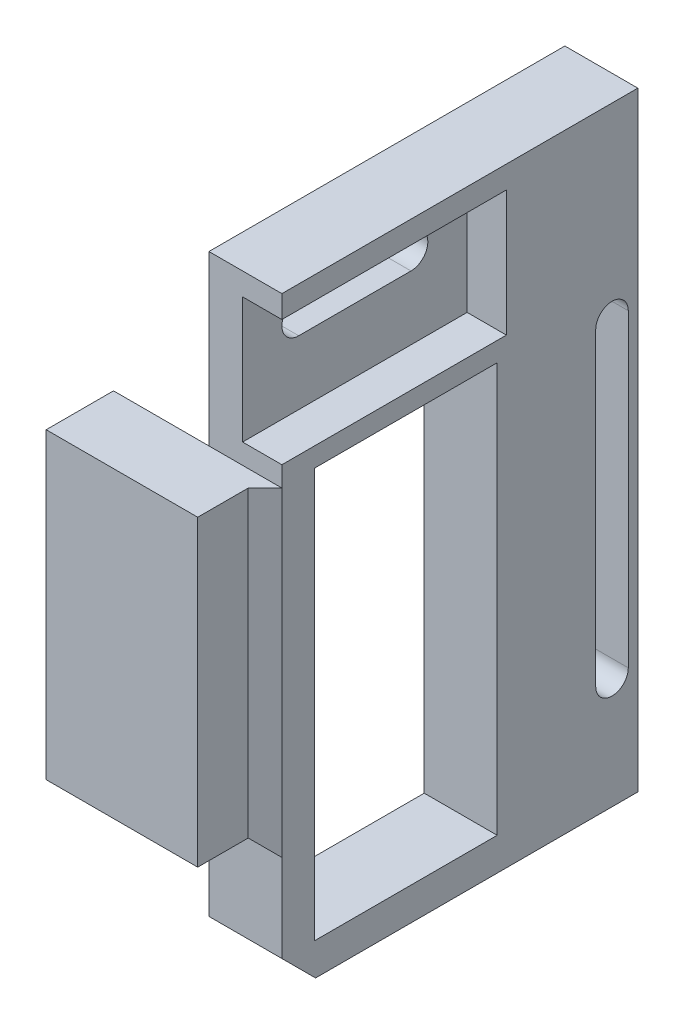
ISO-10303-21;
HEADER;
FILE_DESCRIPTION(('STEP AP214'),'2;1');
FILE_NAME('part.step','',(''),(''),'','','');
FILE_SCHEMA(('AUTOMOTIVE_DESIGN { 1 0 10303 214 1 1 1 1 }'));
ENDSEC;
DATA;
#1=APPLICATION_CONTEXT('core data for automotive mechanical design processes');
#2=APPLICATION_PROTOCOL_DEFINITION('international standard','automotive_design',2000,#1);
#3=PRODUCT_CONTEXT('',#1,'mechanical');
#4=PRODUCT('Part','Part','',(#3));
#5=PRODUCT_RELATED_PRODUCT_CATEGORY('part','',(#4));
#6=PRODUCT_DEFINITION_FORMATION('','',#4);
#7=PRODUCT_DEFINITION_CONTEXT('part definition',#1,'design');
#8=PRODUCT_DEFINITION('design','',#6,#7);
#9=PRODUCT_DEFINITION_SHAPE('','',#8);
#10=(LENGTH_UNIT() NAMED_UNIT(*) SI_UNIT(.MILLI.,.METRE.));
#11=(NAMED_UNIT(*) PLANE_ANGLE_UNIT() SI_UNIT($,.RADIAN.));
#12=(NAMED_UNIT(*) SI_UNIT($,.STERADIAN.) SOLID_ANGLE_UNIT());
#13=UNCERTAINTY_MEASURE_WITH_UNIT(LENGTH_MEASURE(1.E-05),#10,'distance_accuracy_value','');
#14=(GEOMETRIC_REPRESENTATION_CONTEXT(3) GLOBAL_UNCERTAINTY_ASSIGNED_CONTEXT((#13)) GLOBAL_UNIT_ASSIGNED_CONTEXT((#10,
#11,#12)) REPRESENTATION_CONTEXT('',''));
#15=CARTESIAN_POINT('',(0.,0.,0.));
#16=DIRECTION('',(0.,0.,1.));
#17=DIRECTION('',(1.,0.,0.));
#18=AXIS2_PLACEMENT_3D('',#15,#16,#17);
#19=CARTESIAN_POINT('',(6.5,-21.15,13.55));
#20=DIRECTION('',(0.,0.,-1.));
#21=DIRECTION('',(-1.,0.,0.));
#22=AXIS2_PLACEMENT_3D('',#19,#20,#21);
#23=PLANE('',#22);
#24=DIRECTION('',(-1.,0.,0.));
#25=VECTOR('',#24,1.);
#26=CARTESIAN_POINT('',(5.,18.15,13.55));
#27=LINE('',#26,#25);
#28=CARTESIAN_POINT('',(6.5,18.15,13.55));
#29=VERTEX_POINT('',#28);
#30=CARTESIAN_POINT('',(0.,18.15,13.55));
#31=VERTEX_POINT('',#30);
#32=EDGE_CURVE('E343',#29,#31,#27,.T.);
#33=ORIENTED_EDGE('',*,*,#32,.F.);
#34=DIRECTION('',(0.,-1.,0.));
#35=VECTOR('',#34,1.);
#36=CARTESIAN_POINT('',(6.5,-21.15,13.55));
#37=LINE('',#36,#35);
#38=CARTESIAN_POINT('',(6.5,19.95,13.55));
#39=VERTEX_POINT('',#38);
#40=EDGE_CURVE('E401',#39,#29,#37,.T.);
#41=ORIENTED_EDGE('',*,*,#40,.F.);
#42=DIRECTION('',(-1.,0.,0.));
#43=VECTOR('',#42,1.);
#44=CARTESIAN_POINT('',(6.5,19.95,13.55));
#45=LINE('',#44,#43);
#46=CARTESIAN_POINT('',(3.,19.95,13.55));
#47=VERTEX_POINT('',#46);
#48=EDGE_CURVE('E379',#39,#47,#45,.T.);
#49=ORIENTED_EDGE('',*,*,#48,.T.);
#50=DIRECTION('',(0.,1.,0.));
#51=VECTOR('',#50,1.);
#52=CARTESIAN_POINT('',(3.,31.15,13.55));
#53=LINE('',#52,#51);
#54=CARTESIAN_POINT('',(3.,31.15,13.55));
#55=VERTEX_POINT('',#54);
#56=EDGE_CURVE('E360',#47,#55,#53,.T.);
#57=ORIENTED_EDGE('',*,*,#56,.T.);
#58=DIRECTION('',(-1.,0.,0.));
#59=VECTOR('',#58,1.);
#60=CARTESIAN_POINT('',(6.5,31.15,13.55));
#61=LINE('',#60,#59);
#62=CARTESIAN_POINT('',(6.5,31.15,13.55));
#63=VERTEX_POINT('',#62);
#64=EDGE_CURVE('E378',#63,#55,#61,.T.);
#65=ORIENTED_EDGE('',*,*,#64,.F.);
#66=CARTESIAN_POINT('',(6.5,33.15,13.55));
#67=VERTEX_POINT('',#66);
#68=EDGE_CURVE('E397',#67,#63,#37,.T.);
#69=ORIENTED_EDGE('',*,*,#68,.F.);
#70=DIRECTION('',(1.,0.,0.));
#71=VECTOR('',#70,1.);
#72=CARTESIAN_POINT('',(0.,33.15,13.55));
#73=LINE('',#72,#71);
#74=CARTESIAN_POINT('',(0.,33.15,13.55));
#75=VERTEX_POINT('',#74);
#76=EDGE_CURVE('E392',#75,#67,#73,.T.);
#77=ORIENTED_EDGE('',*,*,#76,.F.);
#78=DIRECTION('',(0.,-1.,0.));
#79=VECTOR('',#78,1.);
#80=CARTESIAN_POINT('',(0.,-21.15,13.55));
#81=LINE('',#80,#79);
#82=EDGE_CURVE('E405',#75,#31,#81,.T.);
#83=ORIENTED_EDGE('',*,*,#82,.T.);
#84=EDGE_LOOP('',(#33,#41,#49,#57,#65,#69,#77,#83));
#85=FACE_BOUND('',#84,.T.);
#86=ADVANCED_FACE('F37',(#85),#23,.F.);
#87=CARTESIAN_POINT('',(6.5,0.,0.));
#88=DIRECTION('',(-1.,0.,0.));
#89=DIRECTION('',(0.,0.,1.));
#90=AXIS2_PLACEMENT_3D('',#87,#88,#89);
#91=PLANE('',#90);
#92=DIRECTION('',(0.,1.,0.));
#93=VECTOR('',#92,1.);
#94=CARTESIAN_POINT('',(6.5,11.85,-14.407848490102));
#95=LINE('',#94,#93);
#96=CARTESIAN_POINT('',(6.5,-11.15,-14.407848490102));
#97=VERTEX_POINT('',#96);
#98=CARTESIAN_POINT('',(6.5,16.4,-14.407848490102));
#99=VERTEX_POINT('',#98);
#100=EDGE_CURVE('E244',#97,#99,#95,.T.);
#101=ORIENTED_EDGE('',*,*,#100,.T.);
#102=CARTESIAN_POINT('',(6.5,16.4,-15.857848490102));
#103=DIRECTION('',(1.,0.,0.));
#104=DIRECTION('',(0.,0.,-1.));
#105=AXIS2_PLACEMENT_3D('',#102,#103,#104);
#106=CIRCLE('',#105,1.45);
#107=CARTESIAN_POINT('',(6.5,16.4,-17.307848490102));
#108=VERTEX_POINT('',#107);
#109=EDGE_CURVE('E237',#108,#99,#106,.T.);
#110=ORIENTED_EDGE('',*,*,#109,.F.);
#111=DIRECTION('',(0.,-1.,0.));
#112=VECTOR('',#111,1.);
#113=CARTESIAN_POINT('',(6.5,11.85,-17.307848490102));
#114=LINE('',#113,#112);
#115=CARTESIAN_POINT('',(6.5,-11.15,-17.307848490102));
#116=VERTEX_POINT('',#115);
#117=EDGE_CURVE('E223',#108,#116,#114,.T.);
#118=ORIENTED_EDGE('',*,*,#117,.T.);
#119=CARTESIAN_POINT('',(6.5,-11.15,-15.857848490102));
#120=DIRECTION('',(-1.,0.,0.));
#121=DIRECTION('',(0.,0.,1.));
#122=AXIS2_PLACEMENT_3D('',#119,#120,#121);
#123=CIRCLE('',#122,1.45);
#124=EDGE_CURVE('E53',#116,#97,#123,.T.);
#125=ORIENTED_EDGE('',*,*,#124,.T.);
#126=EDGE_LOOP('',(#101,#110,#118,#125));
#127=FACE_BOUND('',#126,.T.);
#128=DIRECTION('',(0.,0.,1.));
#129=VECTOR('',#128,1.);
#130=CARTESIAN_POINT('',(6.5,-18.23,-5.63));
#131=LINE('',#130,#129);
#132=CARTESIAN_POINT('',(6.5,-18.23,-5.63));
#133=VERTEX_POINT('',#132);
#134=CARTESIAN_POINT('',(6.5,-18.23,10.63));
#135=VERTEX_POINT('',#134);
#136=EDGE_CURVE('E300',#133,#135,#131,.T.);
#137=ORIENTED_EDGE('',*,*,#136,.T.);
#138=DIRECTION('',(0.,1.,0.));
#139=VECTOR('',#138,1.);
#140=CARTESIAN_POINT('',(6.5,-18.23,10.63));
#141=LINE('',#140,#139);
#142=CARTESIAN_POINT('',(6.5,18.23,10.63));
#143=VERTEX_POINT('',#142);
#144=EDGE_CURVE('E290',#135,#143,#141,.T.);
#145=ORIENTED_EDGE('',*,*,#144,.T.);
#146=DIRECTION('',(0.,0.,-1.));
#147=VECTOR('',#146,1.);
#148=CARTESIAN_POINT('',(6.5,18.23,10.63));
#149=LINE('',#148,#147);
#150=CARTESIAN_POINT('',(6.5,18.23,-5.63));
#151=VERTEX_POINT('',#150);
#152=EDGE_CURVE('E293',#143,#151,#149,.T.);
#153=ORIENTED_EDGE('',*,*,#152,.T.);
#154=DIRECTION('',(0.,-1.,0.));
#155=VECTOR('',#154,1.);
#156=CARTESIAN_POINT('',(6.5,18.23,-5.63));
#157=LINE('',#156,#155);
#158=EDGE_CURVE('E297',#151,#133,#157,.T.);
#159=ORIENTED_EDGE('',*,*,#158,.T.);
#160=EDGE_LOOP('',(#137,#145,#153,#159));
#161=FACE_BOUND('',#160,.T.);
#162=DIRECTION('',(0.,0.,-1.));
#163=VECTOR('',#162,1.);
#164=CARTESIAN_POINT('',(6.5,-21.15,13.55));
#165=LINE('',#164,#163);
#166=CARTESIAN_POINT('',(6.5,-21.15,10.55));
#167=VERTEX_POINT('',#166);
#168=CARTESIAN_POINT('',(6.5,-21.15,-18.157848490102));
#169=VERTEX_POINT('',#168);
#170=EDGE_CURVE('E400',#167,#169,#165,.T.);
#171=ORIENTED_EDGE('',*,*,#170,.T.);
#172=DIRECTION('',(0.,1.,0.));
#173=VECTOR('',#172,1.);
#174=CARTESIAN_POINT('',(6.5,0.,-18.157848490102));
#175=LINE('',#174,#173);
#176=CARTESIAN_POINT('',(6.5,33.15,-18.157848490102));
#177=VERTEX_POINT('',#176);
#178=EDGE_CURVE('E357',#169,#177,#175,.T.);
#179=ORIENTED_EDGE('',*,*,#178,.T.);
#180=DIRECTION('',(0.,0.,1.));
#181=VECTOR('',#180,1.);
#182=CARTESIAN_POINT('',(6.5,33.15,-13.55));
#183=LINE('',#182,#181);
#184=EDGE_CURVE('E382',#177,#67,#183,.T.);
#185=ORIENTED_EDGE('',*,*,#184,.T.);
#186=ORIENTED_EDGE('',*,*,#68,.T.);
#187=DIRECTION('',(0.,0.,-1.));
#188=VECTOR('',#187,1.);
#189=CARTESIAN_POINT('',(6.5,31.15,13.55));
#190=LINE('',#189,#188);
#191=CARTESIAN_POINT('',(6.5,31.15,-6.45));
#192=VERTEX_POINT('',#191);
#193=EDGE_CURVE('E369',#63,#192,#190,.T.);
#194=ORIENTED_EDGE('',*,*,#193,.T.);
#195=DIRECTION('',(0.,-1.,0.));
#196=VECTOR('',#195,1.);
#197=CARTESIAN_POINT('',(6.5,31.15,-6.45));
#198=LINE('',#197,#196);
#199=CARTESIAN_POINT('',(6.5,19.95,-6.45));
#200=VERTEX_POINT('',#199);
#201=EDGE_CURVE('E372',#192,#200,#198,.T.);
#202=ORIENTED_EDGE('',*,*,#201,.T.);
#203=DIRECTION('',(0.,0.,1.));
#204=VECTOR('',#203,1.);
#205=CARTESIAN_POINT('',(6.5,19.95,13.55));
#206=LINE('',#205,#204);
#207=EDGE_CURVE('E375',#200,#39,#206,.T.);
#208=ORIENTED_EDGE('',*,*,#207,.T.);
#209=ORIENTED_EDGE('',*,*,#40,.T.);
#210=CARTESIAN_POINT('',(6.5,-10.35,13.55));
#211=VERTEX_POINT('',#210);
#212=EDGE_CURVE('E441',#29,#211,#37,.T.);
#213=ORIENTED_EDGE('',*,*,#212,.T.);
#214=CARTESIAN_POINT('',(6.5,-18.15,13.55));
#215=VERTEX_POINT('',#214);
#216=EDGE_CURVE('E402',#211,#215,#37,.T.);
#217=ORIENTED_EDGE('',*,*,#216,.T.);
#218=DIRECTION('',(0.,0.707106781186549,0.707106781186546));
#219=VECTOR('',#218,1.);
#220=CARTESIAN_POINT('',(6.5,-21.15,10.55));
#221=LINE('',#220,#219);
#222=EDGE_CURVE('E419',#215,#167,#221,.F.);
#223=ORIENTED_EDGE('',*,*,#222,.T.);
#224=EDGE_LOOP('',(#171,#179,#185,#186,#194,#202,#208,#209,#213,#217,#223));
#225=FACE_BOUND('',#224,.T.);
#226=ADVANCED_FACE('F241',(#127,#161,#225),#91,.F.);
#227=CARTESIAN_POINT('',(0.,0.,0.));
#228=DIRECTION('',(-1.,0.,0.));
#229=DIRECTION('',(0.,0.,1.));
#230=AXIS2_PLACEMENT_3D('',#227,#228,#229);
#231=PLANE('',#230);
#232=CARTESIAN_POINT('',(0.,16.4,-15.857848490102));
#233=DIRECTION('',(-1.,0.,0.));
#234=DIRECTION('',(0.,0.,1.));
#235=AXIS2_PLACEMENT_3D('',#232,#233,#234);
#236=CIRCLE('',#235,1.45);
#237=CARTESIAN_POINT('',(0.,16.4,-14.407848490102));
#238=VERTEX_POINT('',#237);
#239=CARTESIAN_POINT('',(0.,16.4,-17.307848490102));
#240=VERTEX_POINT('',#239);
#241=EDGE_CURVE('E11',#238,#240,#236,.T.);
#242=ORIENTED_EDGE('',*,*,#241,.F.);
#243=DIRECTION('',(0.,1.,0.));
#244=VECTOR('',#243,1.);
#245=CARTESIAN_POINT('',(0.,11.85,-14.407848490102));
#246=LINE('',#245,#244);
#247=CARTESIAN_POINT('',(0.,-11.15,-14.407848490102));
#248=VERTEX_POINT('',#247);
#249=EDGE_CURVE('E231',#248,#238,#246,.T.);
#250=ORIENTED_EDGE('',*,*,#249,.F.);
#251=CARTESIAN_POINT('',(0.,-11.15,-15.857848490102));
#252=DIRECTION('',(-1.,0.,0.));
#253=DIRECTION('',(0.,0.,1.));
#254=AXIS2_PLACEMENT_3D('',#251,#252,#253);
#255=CIRCLE('',#254,1.45);
#256=CARTESIAN_POINT('',(0.,-11.15,-17.307848490102));
#257=VERTEX_POINT('',#256);
#258=EDGE_CURVE('E253',#257,#248,#255,.T.);
#259=ORIENTED_EDGE('',*,*,#258,.F.);
#260=DIRECTION('',(0.,-1.,0.));
#261=VECTOR('',#260,1.);
#262=CARTESIAN_POINT('',(0.,11.85,-17.307848490102));
#263=LINE('',#262,#261);
#264=EDGE_CURVE('E248',#240,#257,#263,.T.);
#265=ORIENTED_EDGE('',*,*,#264,.F.);
#266=EDGE_LOOP('',(#242,#250,#259,#265));
#267=FACE_BOUND('',#266,.T.);
#268=DIRECTION('',(0.,-1.,0.));
#269=VECTOR('',#268,1.);
#270=CARTESIAN_POINT('',(0.,33.15,-18.157848490102));
#271=LINE('',#270,#269);
#272=CARTESIAN_POINT('',(0.,33.15,-18.157848490102));
#273=VERTEX_POINT('',#272);
#274=CARTESIAN_POINT('',(0.,-21.15,-18.157848490102));
#275=VERTEX_POINT('',#274);
#276=EDGE_CURVE('E346',#273,#275,#271,.T.);
#277=ORIENTED_EDGE('',*,*,#276,.T.);
#278=DIRECTION('',(0.,0.,-1.));
#279=VECTOR('',#278,1.);
#280=CARTESIAN_POINT('',(0.,-21.15,13.55));
#281=LINE('',#280,#279);
#282=CARTESIAN_POINT('',(0.,-21.15,10.55));
#283=VERTEX_POINT('',#282);
#284=EDGE_CURVE('E408',#283,#275,#281,.T.);
#285=ORIENTED_EDGE('',*,*,#284,.F.);
#286=DIRECTION('',(0.,-0.707106781186549,-0.707106781186546));
#287=VECTOR('',#286,1.);
#288=CARTESIAN_POINT('',(0.,-15.85,15.85));
#289=LINE('',#288,#287);
#290=CARTESIAN_POINT('',(0.,-18.15,13.55));
#291=VERTEX_POINT('',#290);
#292=EDGE_CURVE('E413',#283,#291,#289,.F.);
#293=ORIENTED_EDGE('',*,*,#292,.T.);
#294=CARTESIAN_POINT('',(0.,-10.35,13.55));
#295=VERTEX_POINT('',#294);
#296=EDGE_CURVE('E396',#295,#291,#81,.T.);
#297=ORIENTED_EDGE('',*,*,#296,.F.);
#298=DIRECTION('',(0.,0.707106781186552,0.707106781186543));
#299=VECTOR('',#298,1.);
#300=CARTESIAN_POINT('',(0.,-10.35,13.55));
#301=LINE('',#300,#299);
#302=CARTESIAN_POINT('',(0.,-8.85,15.05));
#303=VERTEX_POINT('',#302);
#304=EDGE_CURVE('E46',#295,#303,#301,.T.);
#305=ORIENTED_EDGE('',*,*,#304,.T.);
#306=DIRECTION('',(0.,0.,1.));
#307=VECTOR('',#306,1.);
#308=CARTESIAN_POINT('',(0.,-8.85,0.));
#309=LINE('',#308,#307);
#310=CARTESIAN_POINT('',(0.,-8.85,13.55));
#311=VERTEX_POINT('',#310);
#312=EDGE_CURVE('E427',#311,#303,#309,.T.);
#313=ORIENTED_EDGE('',*,*,#312,.F.);
#314=EDGE_CURVE('E409',#31,#311,#81,.T.);
#315=ORIENTED_EDGE('',*,*,#314,.F.);
#316=ORIENTED_EDGE('',*,*,#82,.F.);
#317=DIRECTION('',(0.,0.,1.));
#318=VECTOR('',#317,1.);
#319=CARTESIAN_POINT('',(0.,33.15,-13.55));
#320=LINE('',#319,#318);
#321=EDGE_CURVE('E390',#273,#75,#320,.T.);
#322=ORIENTED_EDGE('',*,*,#321,.F.);
#323=EDGE_LOOP('',(#277,#285,#293,#297,#305,#313,#315,#316,#322));
#324=FACE_BOUND('',#323,.T.);
#325=CARTESIAN_POINT('',(0.,27.15,8.55));
#326=DIRECTION('',(-1.,0.,0.));
#327=DIRECTION('',(0.,0.,1.));
#328=AXIS2_PLACEMENT_3D('',#325,#326,#327);
#329=CIRCLE('',#328,1.5);
#330=CARTESIAN_POINT('',(0.,25.65,8.55));
#331=VERTEX_POINT('',#330);
#332=CARTESIAN_POINT('',(0.,28.65,8.55));
#333=VERTEX_POINT('',#332);
#334=EDGE_CURVE('E284',#331,#333,#329,.T.);
#335=ORIENTED_EDGE('',*,*,#334,.F.);
#336=DIRECTION('',(0.,0.,1.));
#337=VECTOR('',#336,1.);
#338=CARTESIAN_POINT('',(0.,25.65,0.));
#339=LINE('',#338,#337);
#340=CARTESIAN_POINT('',(0.,25.65,-1.45));
#341=VERTEX_POINT('',#340);
#342=EDGE_CURVE('E273',#341,#331,#339,.T.);
#343=ORIENTED_EDGE('',*,*,#342,.F.);
#344=CARTESIAN_POINT('',(0.,27.15,-1.45));
#345=DIRECTION('',(-1.,0.,0.));
#346=DIRECTION('',(0.,0.,1.));
#347=AXIS2_PLACEMENT_3D('',#344,#345,#346);
#348=CIRCLE('',#347,1.5);
#349=CARTESIAN_POINT('',(0.,28.65,-1.45));
#350=VERTEX_POINT('',#349);
#351=EDGE_CURVE('E280',#350,#341,#348,.T.);
#352=ORIENTED_EDGE('',*,*,#351,.F.);
#353=DIRECTION('',(0.,0.,-1.));
#354=VECTOR('',#353,1.);
#355=CARTESIAN_POINT('',(0.,28.65,0.));
#356=LINE('',#355,#354);
#357=EDGE_CURVE('E282',#333,#350,#356,.T.);
#358=ORIENTED_EDGE('',*,*,#357,.F.);
#359=EDGE_LOOP('',(#335,#343,#352,#358));
#360=FACE_BOUND('',#359,.T.);
#361=DIRECTION('',(0.,1.,0.));
#362=VECTOR('',#361,1.);
#363=CARTESIAN_POINT('',(0.,-18.23,10.63));
#364=LINE('',#363,#362);
#365=CARTESIAN_POINT('',(0.,-18.23,10.63));
#366=VERTEX_POINT('',#365);
#367=CARTESIAN_POINT('',(0.,18.23,10.63));
#368=VERTEX_POINT('',#367);
#369=EDGE_CURVE('E289',#366,#368,#364,.T.);
#370=ORIENTED_EDGE('',*,*,#369,.F.);
#371=DIRECTION('',(0.,0.,1.));
#372=VECTOR('',#371,1.);
#373=CARTESIAN_POINT('',(0.,-18.23,-5.63));
#374=LINE('',#373,#372);
#375=CARTESIAN_POINT('',(0.,-18.23,-5.63));
#376=VERTEX_POINT('',#375);
#377=EDGE_CURVE('E294',#376,#366,#374,.T.);
#378=ORIENTED_EDGE('',*,*,#377,.F.);
#379=DIRECTION('',(0.,-1.,0.));
#380=VECTOR('',#379,1.);
#381=CARTESIAN_POINT('',(0.,18.23,-5.63));
#382=LINE('',#381,#380);
#383=CARTESIAN_POINT('',(0.,18.23,-5.63));
#384=VERTEX_POINT('',#383);
#385=EDGE_CURVE('E308',#384,#376,#382,.T.);
#386=ORIENTED_EDGE('',*,*,#385,.F.);
#387=DIRECTION('',(0.,0.,-1.));
#388=VECTOR('',#387,1.);
#389=CARTESIAN_POINT('',(0.,18.23,10.63));
#390=LINE('',#389,#388);
#391=EDGE_CURVE('E305',#368,#384,#390,.T.);
#392=ORIENTED_EDGE('',*,*,#391,.F.);
#393=EDGE_LOOP('',(#370,#378,#386,#392));
#394=FACE_BOUND('',#393,.T.);
#395=ADVANCED_FACE('F477',(#267,#324,#360,#394),#231,.T.);
#396=ORIENTED_EDGE('',*,*,#216,.F.);
#397=DIRECTION('',(-1.,0.,0.));
#398=VECTOR('',#397,1.);
#399=CARTESIAN_POINT('',(6.5,-10.35,13.55));
#400=LINE('',#399,#398);
#401=EDGE_CURVE('E421',#211,#295,#400,.T.);
#402=ORIENTED_EDGE('',*,*,#401,.T.);
#403=ORIENTED_EDGE('',*,*,#296,.T.);
#404=DIRECTION('',(1.,0.,0.));
#405=VECTOR('',#404,1.);
#406=CARTESIAN_POINT('',(6.5,-18.15,13.55));
#407=LINE('',#406,#405);
#408=EDGE_CURVE('E416',#291,#215,#407,.T.);
#409=ORIENTED_EDGE('',*,*,#408,.T.);
#410=EDGE_LOOP('',(#396,#402,#403,#409));
#411=FACE_BOUND('',#410,.T.);
#412=ADVANCED_FACE('F448',(#411),#23,.F.);
#413=CARTESIAN_POINT('',(6.5,-21.15,13.55));
#414=DIRECTION('',(0.,1.,0.));
#415=DIRECTION('',(0.,0.,1.));
#416=AXIS2_PLACEMENT_3D('',#413,#414,#415);
#417=PLANE('',#416);
#418=ORIENTED_EDGE('',*,*,#170,.F.);
#419=DIRECTION('',(-1.,0.,0.));
#420=VECTOR('',#419,1.);
#421=CARTESIAN_POINT('',(6.5,-21.15,10.55));
#422=LINE('',#421,#420);
#423=EDGE_CURVE('E404',#167,#283,#422,.T.);
#424=ORIENTED_EDGE('',*,*,#423,.T.);
#425=ORIENTED_EDGE('',*,*,#284,.T.);
#426=DIRECTION('',(1.,0.,0.));
#427=VECTOR('',#426,1.);
#428=CARTESIAN_POINT('',(0.5,-21.15,-18.157848490102));
#429=LINE('',#428,#427);
#430=EDGE_CURVE('E286',#275,#169,#429,.T.);
#431=ORIENTED_EDGE('',*,*,#430,.T.);
#432=EDGE_LOOP('',(#418,#424,#425,#431));
#433=FACE_BOUND('',#432,.T.);
#434=ADVANCED_FACE('F488',(#433),#417,.F.);
#435=CARTESIAN_POINT('',(6.5,-21.15,10.55));
#436=DIRECTION('',(0.,0.707106781186546,-0.707106781186549));
#437=DIRECTION('',(-1.,0.,0.));
#438=AXIS2_PLACEMENT_3D('',#435,#436,#437);
#439=PLANE('',#438);
#440=ORIENTED_EDGE('',*,*,#222,.F.);
#441=ORIENTED_EDGE('',*,*,#408,.F.);
#442=ORIENTED_EDGE('',*,*,#292,.F.);
#443=ORIENTED_EDGE('',*,*,#423,.F.);
#444=EDGE_LOOP('',(#440,#441,#442,#443));
#445=FACE_BOUND('',#444,.T.);
#446=ADVANCED_FACE('F485',(#445),#439,.F.);
#447=CARTESIAN_POINT('',(0.,33.15,-13.55));
#448=DIRECTION('',(0.,1.,0.));
#449=DIRECTION('',(0.,0.,1.));
#450=AXIS2_PLACEMENT_3D('',#447,#448,#449);
#451=PLANE('',#450);
#452=DIRECTION('',(1.,0.,0.));
#453=VECTOR('',#452,1.);
#454=CARTESIAN_POINT('',(0.,33.15,-18.157848490102));
#455=LINE('',#454,#453);
#456=EDGE_CURVE('E355',#273,#177,#455,.T.);
#457=ORIENTED_EDGE('',*,*,#456,.F.);
#458=ORIENTED_EDGE('',*,*,#321,.T.);
#459=ORIENTED_EDGE('',*,*,#76,.T.);
#460=ORIENTED_EDGE('',*,*,#184,.F.);
#461=EDGE_LOOP('',(#457,#458,#459,#460));
#462=FACE_BOUND('',#461,.T.);
#463=ADVANCED_FACE('F472',(#462),#451,.T.);
#464=CARTESIAN_POINT('',(6.5,19.95,13.55));
#465=DIRECTION('',(0.,-1.,0.));
#466=DIRECTION('',(0.,0.,-1.));
#467=AXIS2_PLACEMENT_3D('',#464,#465,#466);
#468=PLANE('',#467);
#469=DIRECTION('',(-1.,0.,0.));
#470=VECTOR('',#469,1.);
#471=CARTESIAN_POINT('',(6.5,19.95,-6.45));
#472=LINE('',#471,#470);
#473=CARTESIAN_POINT('',(3.,19.95,-6.45));
#474=VERTEX_POINT('',#473);
#475=EDGE_CURVE('E383',#200,#474,#472,.T.);
#476=ORIENTED_EDGE('',*,*,#475,.T.);
#477=DIRECTION('',(0.,0.,1.));
#478=VECTOR('',#477,1.);
#479=CARTESIAN_POINT('',(3.,19.95,13.55));
#480=LINE('',#479,#478);
#481=EDGE_CURVE('E367',#474,#47,#480,.T.);
#482=ORIENTED_EDGE('',*,*,#481,.T.);
#483=ORIENTED_EDGE('',*,*,#48,.F.);
#484=ORIENTED_EDGE('',*,*,#207,.F.);
#485=EDGE_LOOP('',(#476,#482,#483,#484));
#486=FACE_BOUND('',#485,.T.);
#487=ADVANCED_FACE('F458',(#486),#468,.F.);
#488=CARTESIAN_POINT('',(6.5,31.15,-6.45));
#489=DIRECTION('',(0.,0.,-1.));
#490=DIRECTION('',(0.,1.,0.));
#491=AXIS2_PLACEMENT_3D('',#488,#489,#490);
#492=PLANE('',#491);
#493=DIRECTION('',(-1.,0.,0.));
#494=VECTOR('',#493,1.);
#495=CARTESIAN_POINT('',(6.5,31.15,-6.45));
#496=LINE('',#495,#494);
#497=CARTESIAN_POINT('',(3.,31.15,-6.45));
#498=VERTEX_POINT('',#497);
#499=EDGE_CURVE('E386',#192,#498,#496,.T.);
#500=ORIENTED_EDGE('',*,*,#499,.T.);
#501=DIRECTION('',(0.,-1.,0.));
#502=VECTOR('',#501,1.);
#503=CARTESIAN_POINT('',(3.,31.15,-6.45));
#504=LINE('',#503,#502);
#505=EDGE_CURVE('E365',#498,#474,#504,.T.);
#506=ORIENTED_EDGE('',*,*,#505,.T.);
#507=ORIENTED_EDGE('',*,*,#475,.F.);
#508=ORIENTED_EDGE('',*,*,#201,.F.);
#509=EDGE_LOOP('',(#500,#506,#507,#508));
#510=FACE_BOUND('',#509,.T.);
#511=ADVANCED_FACE('F529',(#510),#492,.F.);
#512=CARTESIAN_POINT('',(6.5,31.15,13.55));
#513=DIRECTION('',(0.,1.,0.));
#514=DIRECTION('',(0.,0.,1.));
#515=AXIS2_PLACEMENT_3D('',#512,#513,#514);
#516=PLANE('',#515);
#517=ORIENTED_EDGE('',*,*,#64,.T.);
#518=DIRECTION('',(0.,0.,-1.));
#519=VECTOR('',#518,1.);
#520=CARTESIAN_POINT('',(3.,31.15,13.55));
#521=LINE('',#520,#519);
#522=EDGE_CURVE('E363',#55,#498,#521,.T.);
#523=ORIENTED_EDGE('',*,*,#522,.T.);
#524=ORIENTED_EDGE('',*,*,#499,.F.);
#525=ORIENTED_EDGE('',*,*,#193,.F.);
#526=EDGE_LOOP('',(#517,#523,#524,#525));
#527=FACE_BOUND('',#526,.T.);
#528=ADVANCED_FACE('F503',(#527),#516,.F.);
#529=CARTESIAN_POINT('',(3.,0.,0.));
#530=DIRECTION('',(1.,0.,0.));
#531=DIRECTION('',(0.,0.,-1.));
#532=AXIS2_PLACEMENT_3D('',#529,#530,#531);
#533=PLANE('',#532);
#534=CARTESIAN_POINT('',(3.,27.15,8.55));
#535=DIRECTION('',(1.,0.,0.));
#536=DIRECTION('',(0.,0.,-1.));
#537=AXIS2_PLACEMENT_3D('',#534,#535,#536);
#538=CIRCLE('',#537,1.5);
#539=CARTESIAN_POINT('',(3.,28.65,8.55));
#540=VERTEX_POINT('',#539);
#541=CARTESIAN_POINT('',(3.,25.65,8.55));
#542=VERTEX_POINT('',#541);
#543=EDGE_CURVE('E259',#540,#542,#538,.T.);
#544=ORIENTED_EDGE('',*,*,#543,.F.);
#545=DIRECTION('',(0.,0.,1.));
#546=VECTOR('',#545,1.);
#547=CARTESIAN_POINT('',(3.,28.65,8.55));
#548=LINE('',#547,#546);
#549=CARTESIAN_POINT('',(3.,28.65,-1.45));
#550=VERTEX_POINT('',#549);
#551=EDGE_CURVE('E267',#550,#540,#548,.T.);
#552=ORIENTED_EDGE('',*,*,#551,.F.);
#553=CARTESIAN_POINT('',(3.,27.15,-1.45));
#554=DIRECTION('',(1.,0.,0.));
#555=DIRECTION('',(0.,0.,-1.));
#556=AXIS2_PLACEMENT_3D('',#553,#554,#555);
#557=CIRCLE('',#556,1.5);
#558=CARTESIAN_POINT('',(3.,25.65,-1.45));
#559=VERTEX_POINT('',#558);
#560=EDGE_CURVE('E264',#559,#550,#557,.T.);
#561=ORIENTED_EDGE('',*,*,#560,.F.);
#562=DIRECTION('',(0.,0.,-1.));
#563=VECTOR('',#562,1.);
#564=CARTESIAN_POINT('',(3.,25.65,8.55));
#565=LINE('',#564,#563);
#566=EDGE_CURVE('E262',#542,#559,#565,.T.);
#567=ORIENTED_EDGE('',*,*,#566,.F.);
#568=EDGE_LOOP('',(#544,#552,#561,#567));
#569=FACE_BOUND('',#568,.T.);
#570=ORIENTED_EDGE('',*,*,#56,.F.);
#571=ORIENTED_EDGE('',*,*,#481,.F.);
#572=ORIENTED_EDGE('',*,*,#505,.F.);
#573=ORIENTED_EDGE('',*,*,#522,.F.);
#574=EDGE_LOOP('',(#570,#571,#572,#573));
#575=FACE_BOUND('',#574,.T.);
#576=ADVANCED_FACE('F462',(#569,#575),#533,.T.);
#577=CARTESIAN_POINT('',(0.,33.15,-18.157848490102));
#578=DIRECTION('',(0.,0.,1.));
#579=DIRECTION('',(1.,0.,0.));
#580=AXIS2_PLACEMENT_3D('',#577,#578,#579);
#581=PLANE('',#580);
#582=ORIENTED_EDGE('',*,*,#430,.F.);
#583=ORIENTED_EDGE('',*,*,#276,.F.);
#584=ORIENTED_EDGE('',*,*,#456,.T.);
#585=ORIENTED_EDGE('',*,*,#178,.F.);
#586=EDGE_LOOP('',(#582,#583,#584,#585));
#587=FACE_BOUND('',#586,.T.);
#588=ADVANCED_FACE('F491',(#587),#581,.F.);
#589=CARTESIAN_POINT('',(5.,18.15,13.55));
#590=DIRECTION('',(0.,0.,-1.));
#591=DIRECTION('',(0.,1.,0.));
#592=AXIS2_PLACEMENT_3D('',#589,#590,#591);
#593=PLANE('',#592);
#594=CARTESIAN_POINT('',(-8.5,18.15,13.55));
#595=VERTEX_POINT('',#594);
#596=EDGE_CURVE('E347',#31,#595,#27,.T.);
#597=ORIENTED_EDGE('',*,*,#596,.F.);
#598=ORIENTED_EDGE('',*,*,#314,.T.);
#599=DIRECTION('',(-1.,0.,0.));
#600=VECTOR('',#599,1.);
#601=CARTESIAN_POINT('',(5.,-8.85,13.55));
#602=LINE('',#601,#600);
#603=CARTESIAN_POINT('',(-8.5,-8.85,13.55));
#604=VERTEX_POINT('',#603);
#605=EDGE_CURVE('E342',#311,#604,#602,.T.);
#606=ORIENTED_EDGE('',*,*,#605,.T.);
#607=DIRECTION('',(0.,-1.,0.));
#608=VECTOR('',#607,1.);
#609=CARTESIAN_POINT('',(-8.5,18.15,13.55));
#610=LINE('',#609,#608);
#611=EDGE_CURVE('E322',#595,#604,#610,.T.);
#612=ORIENTED_EDGE('',*,*,#611,.F.);
#613=EDGE_LOOP('',(#597,#598,#606,#612));
#614=FACE_BOUND('',#613,.T.);
#615=ADVANCED_FACE('F493',(#614),#593,.T.);
#616=CARTESIAN_POINT('',(5.,18.15,13.55));
#617=DIRECTION('',(0.,1.,0.));
#618=DIRECTION('',(0.,0.,1.));
#619=AXIS2_PLACEMENT_3D('',#616,#617,#618);
#620=PLANE('',#619);
#621=ORIENTED_EDGE('',*,*,#32,.T.);
#622=ORIENTED_EDGE('',*,*,#596,.T.);
#623=DIRECTION('',(0.,0.,-1.));
#624=VECTOR('',#623,1.);
#625=CARTESIAN_POINT('',(-8.5,18.15,13.55));
#626=LINE('',#625,#624);
#627=CARTESIAN_POINT('',(-8.5,18.15,19.55));
#628=VERTEX_POINT('',#627);
#629=EDGE_CURVE('E331',#628,#595,#626,.T.);
#630=ORIENTED_EDGE('',*,*,#629,.F.);
#631=DIRECTION('',(-1.,0.,0.));
#632=VECTOR('',#631,1.);
#633=CARTESIAN_POINT('',(5.,18.15,19.55));
#634=LINE('',#633,#632);
#635=CARTESIAN_POINT('',(5.,18.15,19.55));
#636=VERTEX_POINT('',#635);
#637=EDGE_CURVE('E348',#636,#628,#634,.T.);
#638=ORIENTED_EDGE('',*,*,#637,.F.);
#639=DIRECTION('',(0.,0.,-1.));
#640=VECTOR('',#639,1.);
#641=CARTESIAN_POINT('',(5.,18.15,13.55));
#642=LINE('',#641,#640);
#643=CARTESIAN_POINT('',(5.,18.15,15.05));
#644=VERTEX_POINT('',#643);
#645=EDGE_CURVE('E339',#636,#644,#642,.T.);
#646=ORIENTED_EDGE('',*,*,#645,.T.);
#647=DIRECTION('',(-0.707106781186549,0.,0.707106781186546));
#648=VECTOR('',#647,1.);
#649=CARTESIAN_POINT('',(6.5,18.15,13.55));
#650=LINE('',#649,#648);
#651=EDGE_CURVE('E430',#644,#29,#650,.F.);
#652=ORIENTED_EDGE('',*,*,#651,.T.);
#653=EDGE_LOOP('',(#621,#622,#630,#638,#646,#652));
#654=FACE_BOUND('',#653,.T.);
#655=ADVANCED_FACE('F500',(#654),#620,.T.);
#656=CARTESIAN_POINT('',(5.,18.15,19.55));
#657=DIRECTION('',(0.,0.,1.));
#658=DIRECTION('',(0.,-1.,0.));
#659=AXIS2_PLACEMENT_3D('',#656,#657,#658);
#660=PLANE('',#659);
#661=ORIENTED_EDGE('',*,*,#637,.T.);
#662=DIRECTION('',(0.,1.,0.));
#663=VECTOR('',#662,1.);
#664=CARTESIAN_POINT('',(-8.5,18.15,19.55));
#665=LINE('',#664,#663);
#666=CARTESIAN_POINT('',(-8.5,-8.85,19.55));
#667=VERTEX_POINT('',#666);
#668=EDGE_CURVE('E328',#667,#628,#665,.T.);
#669=ORIENTED_EDGE('',*,*,#668,.F.);
#670=DIRECTION('',(-1.,0.,0.));
#671=VECTOR('',#670,1.);
#672=CARTESIAN_POINT('',(5.,-8.85,19.55));
#673=LINE('',#672,#671);
#674=CARTESIAN_POINT('',(5.,-8.85,19.55));
#675=VERTEX_POINT('',#674);
#676=EDGE_CURVE('E350',#675,#667,#673,.T.);
#677=ORIENTED_EDGE('',*,*,#676,.F.);
#678=DIRECTION('',(0.,1.,0.));
#679=VECTOR('',#678,1.);
#680=CARTESIAN_POINT('',(5.,18.15,19.55));
#681=LINE('',#680,#679);
#682=EDGE_CURVE('E336',#675,#636,#681,.T.);
#683=ORIENTED_EDGE('',*,*,#682,.T.);
#684=EDGE_LOOP('',(#661,#669,#677,#683));
#685=FACE_BOUND('',#684,.T.);
#686=ADVANCED_FACE('F568',(#685),#660,.T.);
#687=CARTESIAN_POINT('',(5.,-8.85,13.55));
#688=DIRECTION('',(0.,-1.,0.));
#689=DIRECTION('',(0.,0.,-1.));
#690=AXIS2_PLACEMENT_3D('',#687,#688,#689);
#691=PLANE('',#690);
#692=ORIENTED_EDGE('',*,*,#605,.F.);
#693=ORIENTED_EDGE('',*,*,#312,.T.);
#694=DIRECTION('',(1.,0.,0.));
#695=VECTOR('',#694,1.);
#696=CARTESIAN_POINT('',(5.,-8.85,15.05));
#697=LINE('',#696,#695);
#698=CARTESIAN_POINT('',(5.,-8.85,15.05));
#699=VERTEX_POINT('',#698);
#700=EDGE_CURVE('E425',#303,#699,#697,.T.);
#701=ORIENTED_EDGE('',*,*,#700,.T.);
#702=DIRECTION('',(0.,0.,1.));
#703=VECTOR('',#702,1.);
#704=CARTESIAN_POINT('',(5.,-8.85,13.55));
#705=LINE('',#704,#703);
#706=EDGE_CURVE('E334',#699,#675,#705,.T.);
#707=ORIENTED_EDGE('',*,*,#706,.T.);
#708=ORIENTED_EDGE('',*,*,#676,.T.);
#709=DIRECTION('',(0.,0.,1.));
#710=VECTOR('',#709,1.);
#711=CARTESIAN_POINT('',(-8.5,-8.85,13.55));
#712=LINE('',#711,#710);
#713=EDGE_CURVE('E325',#604,#667,#712,.T.);
#714=ORIENTED_EDGE('',*,*,#713,.F.);
#715=EDGE_LOOP('',(#692,#693,#701,#707,#708,#714));
#716=FACE_BOUND('',#715,.T.);
#717=ADVANCED_FACE('F576',(#716),#691,.T.);
#718=CARTESIAN_POINT('',(5.,0.,0.));
#719=DIRECTION('',(-1.,0.,0.));
#720=DIRECTION('',(0.,0.,1.));
#721=AXIS2_PLACEMENT_3D('',#718,#719,#720);
#722=PLANE('',#721);
#723=ORIENTED_EDGE('',*,*,#706,.F.);
#724=DIRECTION('',(0.,1.,0.));
#725=VECTOR('',#724,1.);
#726=CARTESIAN_POINT('',(5.,18.15,15.05));
#727=LINE('',#726,#725);
#728=EDGE_CURVE('E423',#699,#644,#727,.T.);
#729=ORIENTED_EDGE('',*,*,#728,.T.);
#730=ORIENTED_EDGE('',*,*,#645,.F.);
#731=ORIENTED_EDGE('',*,*,#682,.F.);
#732=EDGE_LOOP('',(#723,#729,#730,#731));
#733=FACE_BOUND('',#732,.T.);
#734=ADVANCED_FACE('F584',(#733),#722,.F.);
#735=CARTESIAN_POINT('',(-8.5,0.,0.));
#736=DIRECTION('',(-1.,0.,0.));
#737=DIRECTION('',(0.,0.,1.));
#738=AXIS2_PLACEMENT_3D('',#735,#736,#737);
#739=PLANE('',#738);
#740=ORIENTED_EDGE('',*,*,#611,.T.);
#741=ORIENTED_EDGE('',*,*,#713,.T.);
#742=ORIENTED_EDGE('',*,*,#668,.T.);
#743=ORIENTED_EDGE('',*,*,#629,.T.);
#744=EDGE_LOOP('',(#740,#741,#742,#743));
#745=FACE_BOUND('',#744,.T.);
#746=ADVANCED_FACE('F592',(#745),#739,.T.);
#747=CARTESIAN_POINT('',(6.5,-10.35,13.55));
#748=DIRECTION('',(0.,0.707106781186543,-0.707106781186552));
#749=DIRECTION('',(-1.,0.,0.));
#750=AXIS2_PLACEMENT_3D('',#747,#748,#749);
#751=PLANE('',#750);
#752=ORIENTED_EDGE('',*,*,#304,.F.);
#753=ORIENTED_EDGE('',*,*,#401,.F.);
#754=DIRECTION('',(0.577350269189624,-0.577350269189631,-0.577350269189622));
#755=VECTOR('',#754,1.);
#756=CARTESIAN_POINT('',(6.5,-10.35,13.55));
#757=LINE('',#756,#755);
#758=EDGE_CURVE('E315',#699,#211,#757,.T.);
#759=ORIENTED_EDGE('',*,*,#758,.F.);
#760=ORIENTED_EDGE('',*,*,#700,.F.);
#761=EDGE_LOOP('',(#752,#753,#759,#760));
#762=FACE_BOUND('',#761,.T.);
#763=ADVANCED_FACE('F40',(#762),#751,.F.);
#764=CARTESIAN_POINT('',(6.5,-21.15,13.55));
#765=DIRECTION('',(0.707106781186546,0.,0.707106781186549));
#766=DIRECTION('',(0.,1.,0.));
#767=AXIS2_PLACEMENT_3D('',#764,#765,#766);
#768=PLANE('',#767);
#769=ORIENTED_EDGE('',*,*,#651,.F.);
#770=ORIENTED_EDGE('',*,*,#728,.F.);
#771=ORIENTED_EDGE('',*,*,#758,.T.);
#772=ORIENTED_EDGE('',*,*,#212,.F.);
#773=EDGE_LOOP('',(#769,#770,#771,#772));
#774=FACE_BOUND('',#773,.T.);
#775=ADVANCED_FACE('F439',(#774),#768,.T.);
#776=CARTESIAN_POINT('',(6.5,-18.23,10.63));
#777=DIRECTION('',(0.,0.,1.));
#778=DIRECTION('',(1.,0.,0.));
#779=AXIS2_PLACEMENT_3D('',#776,#777,#778);
#780=PLANE('',#779);
#781=ORIENTED_EDGE('',*,*,#369,.T.);
#782=DIRECTION('',(-1.,0.,0.));
#783=VECTOR('',#782,1.);
#784=CARTESIAN_POINT('',(6.5,18.23,10.63));
#785=LINE('',#784,#783);
#786=EDGE_CURVE('E303',#143,#368,#785,.T.);
#787=ORIENTED_EDGE('',*,*,#786,.F.);
#788=ORIENTED_EDGE('',*,*,#144,.F.);
#789=DIRECTION('',(-1.,0.,0.));
#790=VECTOR('',#789,1.);
#791=CARTESIAN_POINT('',(6.5,-18.23,10.63));
#792=LINE('',#791,#790);
#793=EDGE_CURVE('E313',#135,#366,#792,.T.);
#794=ORIENTED_EDGE('',*,*,#793,.T.);
#795=EDGE_LOOP('',(#781,#787,#788,#794));
#796=FACE_BOUND('',#795,.T.);
#797=ADVANCED_FACE('F611',(#796),#780,.F.);
#798=CARTESIAN_POINT('',(6.5,-18.23,-5.63));
#799=DIRECTION('',(0.,-1.,0.));
#800=DIRECTION('',(0.,0.,-1.));
#801=AXIS2_PLACEMENT_3D('',#798,#799,#800);
#802=PLANE('',#801);
#803=ORIENTED_EDGE('',*,*,#377,.T.);
#804=ORIENTED_EDGE('',*,*,#793,.F.);
#805=ORIENTED_EDGE('',*,*,#136,.F.);
#806=DIRECTION('',(-1.,0.,0.));
#807=VECTOR('',#806,1.);
#808=CARTESIAN_POINT('',(6.5,-18.23,-5.63));
#809=LINE('',#808,#807);
#810=EDGE_CURVE('E316',#133,#376,#809,.T.);
#811=ORIENTED_EDGE('',*,*,#810,.T.);
#812=EDGE_LOOP('',(#803,#804,#805,#811));
#813=FACE_BOUND('',#812,.T.);
#814=ADVANCED_FACE('F701',(#813),#802,.F.);
#815=CARTESIAN_POINT('',(6.5,18.23,-5.63));
#816=DIRECTION('',(0.,0.,-1.));
#817=DIRECTION('',(-1.,0.,0.));
#818=AXIS2_PLACEMENT_3D('',#815,#816,#817);
#819=PLANE('',#818);
#820=ORIENTED_EDGE('',*,*,#385,.T.);
#821=ORIENTED_EDGE('',*,*,#810,.F.);
#822=ORIENTED_EDGE('',*,*,#158,.F.);
#823=DIRECTION('',(-1.,0.,0.));
#824=VECTOR('',#823,1.);
#825=CARTESIAN_POINT('',(6.5,18.23,-5.63));
#826=LINE('',#825,#824);
#827=EDGE_CURVE('E318',#151,#384,#826,.T.);
#828=ORIENTED_EDGE('',*,*,#827,.T.);
#829=EDGE_LOOP('',(#820,#821,#822,#828));
#830=FACE_BOUND('',#829,.T.);
#831=ADVANCED_FACE('F704',(#830),#819,.F.);
#832=CARTESIAN_POINT('',(6.5,18.23,10.63));
#833=DIRECTION('',(0.,1.,0.));
#834=DIRECTION('',(0.,0.,1.));
#835=AXIS2_PLACEMENT_3D('',#832,#833,#834);
#836=PLANE('',#835);
#837=ORIENTED_EDGE('',*,*,#391,.T.);
#838=ORIENTED_EDGE('',*,*,#827,.F.);
#839=ORIENTED_EDGE('',*,*,#152,.F.);
#840=ORIENTED_EDGE('',*,*,#786,.T.);
#841=EDGE_LOOP('',(#837,#838,#839,#840));
#842=FACE_BOUND('',#841,.T.);
#843=ADVANCED_FACE('F699',(#842),#836,.F.);
#844=CARTESIAN_POINT('',(-3.,27.15,8.55));
#845=DIRECTION('',(1.,0.,0.));
#846=DIRECTION('',(0.,0.,-1.));
#847=AXIS2_PLACEMENT_3D('',#844,#845,#846);
#848=CYLINDRICAL_SURFACE('',#847,1.5);
#849=ORIENTED_EDGE('',*,*,#334,.T.);
#850=DIRECTION('',(1.,0.,0.));
#851=VECTOR('',#850,1.);
#852=CARTESIAN_POINT('',(-3.,28.65,8.55));
#853=LINE('',#852,#851);
#854=EDGE_CURVE('E271',#333,#540,#853,.T.);
#855=ORIENTED_EDGE('',*,*,#854,.T.);
#856=ORIENTED_EDGE('',*,*,#543,.T.);
#857=DIRECTION('',(1.,0.,0.));
#858=VECTOR('',#857,1.);
#859=CARTESIAN_POINT('',(-3.,25.65,8.55));
#860=LINE('',#859,#858);
#861=EDGE_CURVE('E270',#331,#542,#860,.T.);
#862=ORIENTED_EDGE('',*,*,#861,.F.);
#863=EDGE_LOOP('',(#849,#855,#856,#862));
#864=FACE_BOUND('',#863,.T.);
#865=ADVANCED_FACE('F692',(#864),#848,.F.);
#866=CARTESIAN_POINT('',(-3.,28.65,8.55));
#867=DIRECTION('',(0.,1.,0.));
#868=DIRECTION('',(0.,0.,1.));
#869=AXIS2_PLACEMENT_3D('',#866,#867,#868);
#870=PLANE('',#869);
#871=ORIENTED_EDGE('',*,*,#357,.T.);
#872=DIRECTION('',(1.,0.,0.));
#873=VECTOR('',#872,1.);
#874=CARTESIAN_POINT('',(-3.,28.65,-1.45));
#875=LINE('',#874,#873);
#876=EDGE_CURVE('E274',#350,#550,#875,.T.);
#877=ORIENTED_EDGE('',*,*,#876,.T.);
#878=ORIENTED_EDGE('',*,*,#551,.T.);
#879=ORIENTED_EDGE('',*,*,#854,.F.);
#880=EDGE_LOOP('',(#871,#877,#878,#879));
#881=FACE_BOUND('',#880,.T.);
#882=ADVANCED_FACE('F688',(#881),#870,.F.);
#883=CARTESIAN_POINT('',(-3.,27.15,-1.45));
#884=DIRECTION('',(1.,0.,0.));
#885=DIRECTION('',(0.,0.,-1.));
#886=AXIS2_PLACEMENT_3D('',#883,#884,#885);
#887=CYLINDRICAL_SURFACE('',#886,1.5);
#888=ORIENTED_EDGE('',*,*,#351,.T.);
#889=DIRECTION('',(1.,0.,0.));
#890=VECTOR('',#889,1.);
#891=CARTESIAN_POINT('',(-3.,25.65,-1.45));
#892=LINE('',#891,#890);
#893=EDGE_CURVE('E61',#341,#559,#892,.T.);
#894=ORIENTED_EDGE('',*,*,#893,.T.);
#895=ORIENTED_EDGE('',*,*,#560,.T.);
#896=ORIENTED_EDGE('',*,*,#876,.F.);
#897=EDGE_LOOP('',(#888,#894,#895,#896));
#898=FACE_BOUND('',#897,.T.);
#899=ADVANCED_FACE('F691',(#898),#887,.F.);
#900=CARTESIAN_POINT('',(-3.,25.65,8.55));
#901=DIRECTION('',(0.,-1.,0.));
#902=DIRECTION('',(0.,0.,-1.));
#903=AXIS2_PLACEMENT_3D('',#900,#901,#902);
#904=PLANE('',#903);
#905=ORIENTED_EDGE('',*,*,#342,.T.);
#906=ORIENTED_EDGE('',*,*,#861,.T.);
#907=ORIENTED_EDGE('',*,*,#566,.T.);
#908=ORIENTED_EDGE('',*,*,#893,.F.);
#909=EDGE_LOOP('',(#905,#906,#907,#908));
#910=FACE_BOUND('',#909,.T.);
#911=ADVANCED_FACE('F638',(#910),#904,.F.);
#912=CARTESIAN_POINT('',(6.5,11.85,-14.407848490102));
#913=DIRECTION('',(0.,0.,1.));
#914=DIRECTION('',(0.,-1.,0.));
#915=AXIS2_PLACEMENT_3D('',#912,#913,#914);
#916=PLANE('',#915);
#917=ORIENTED_EDGE('',*,*,#249,.T.);
#918=DIRECTION('',(1.,0.,0.));
#919=VECTOR('',#918,1.);
#920=CARTESIAN_POINT('',(-3.5,16.4,-14.407848490102));
#921=LINE('',#920,#919);
#922=EDGE_CURVE('E239',#238,#99,#921,.T.);
#923=ORIENTED_EDGE('',*,*,#922,.T.);
#924=ORIENTED_EDGE('',*,*,#100,.F.);
#925=DIRECTION('',(-1.,0.,0.));
#926=VECTOR('',#925,1.);
#927=CARTESIAN_POINT('',(6.5,-11.15,-14.407848490102));
#928=LINE('',#927,#926);
#929=EDGE_CURVE('E257',#97,#248,#928,.T.);
#930=ORIENTED_EDGE('',*,*,#929,.T.);
#931=EDGE_LOOP('',(#917,#923,#924,#930));
#932=FACE_BOUND('',#931,.T.);
#933=ADVANCED_FACE('F651',(#932),#916,.F.);
#934=CARTESIAN_POINT('',(6.5,-11.15,-15.857848490102));
#935=DIRECTION('',(-1.,0.,0.));
#936=DIRECTION('',(0.,0.,1.));
#937=AXIS2_PLACEMENT_3D('',#934,#935,#936);
#938=CYLINDRICAL_SURFACE('',#937,1.45);
#939=ORIENTED_EDGE('',*,*,#258,.T.);
#940=ORIENTED_EDGE('',*,*,#929,.F.);
#941=ORIENTED_EDGE('',*,*,#124,.F.);
#942=DIRECTION('',(-1.,0.,0.));
#943=VECTOR('',#942,1.);
#944=CARTESIAN_POINT('',(6.5,-11.15,-17.307848490102));
#945=LINE('',#944,#943);
#946=EDGE_CURVE('E228',#116,#257,#945,.T.);
#947=ORIENTED_EDGE('',*,*,#946,.T.);
#948=EDGE_LOOP('',(#939,#940,#941,#947));
#949=FACE_BOUND('',#948,.T.);
#950=ADVANCED_FACE('F647',(#949),#938,.F.);
#951=CARTESIAN_POINT('',(6.5,11.85,-17.307848490102));
#952=DIRECTION('',(0.,0.,-1.));
#953=DIRECTION('',(0.,1.,0.));
#954=AXIS2_PLACEMENT_3D('',#951,#952,#953);
#955=PLANE('',#954);
#956=ORIENTED_EDGE('',*,*,#264,.T.);
#957=ORIENTED_EDGE('',*,*,#946,.F.);
#958=ORIENTED_EDGE('',*,*,#117,.F.);
#959=DIRECTION('',(1.,0.,0.));
#960=VECTOR('',#959,1.);
#961=CARTESIAN_POINT('',(-3.5,16.4,-17.307848490102));
#962=LINE('',#961,#960);
#963=EDGE_CURVE('E227',#240,#108,#962,.T.);
#964=ORIENTED_EDGE('',*,*,#963,.F.);
#965=EDGE_LOOP('',(#956,#957,#958,#964));
#966=FACE_BOUND('',#965,.T.);
#967=ADVANCED_FACE('F226',(#966),#955,.F.);
#968=CARTESIAN_POINT('',(-3.5,16.4,-15.857848490102));
#969=DIRECTION('',(1.,0.,0.));
#970=DIRECTION('',(0.,0.,-1.));
#971=AXIS2_PLACEMENT_3D('',#968,#969,#970);
#972=CYLINDRICAL_SURFACE('',#971,1.45);
#973=ORIENTED_EDGE('',*,*,#241,.T.);
#974=ORIENTED_EDGE('',*,*,#963,.T.);
#975=ORIENTED_EDGE('',*,*,#109,.T.);
#976=ORIENTED_EDGE('',*,*,#922,.F.);
#977=EDGE_LOOP('',(#973,#974,#975,#976));
#978=FACE_BOUND('',#977,.T.);
#979=ADVANCED_FACE('F235',(#978),#972,.F.);
#980=CLOSED_SHELL('',(#86,#226,#395,#412,#434,#446,#463,#487,#511,#528,#576,#588,#615,#655,#686,
#717,#734,#746,#763,#775,#797,#814,#831,#843,#865,#882,#899,#911,#933,#950,#967,#979));
#981=MANIFOLD_SOLID_BREP('B2',#980);
#982=ADVANCED_BREP_SHAPE_REPRESENTATION('',(#18,#981),#14);
#983=SHAPE_DEFINITION_REPRESENTATION(#9,#982);
ENDSEC;
END-ISO-10303-21;
